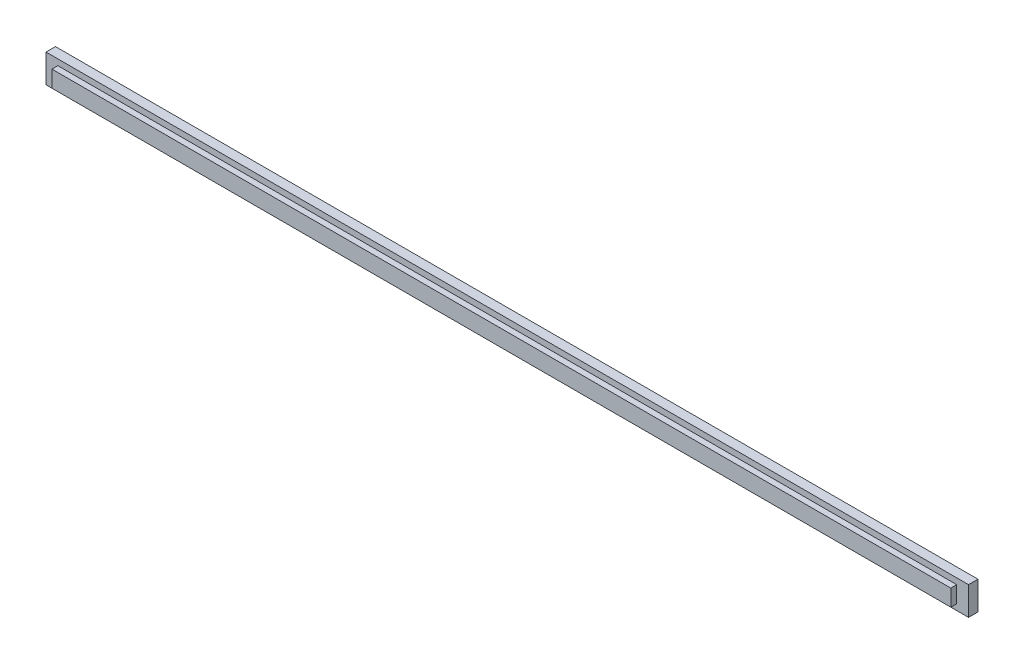
ISO-10303-21;
HEADER;
FILE_DESCRIPTION(('STEP AP214'),'2;1');
FILE_NAME('part.step','',(''),(''),'','','');
FILE_SCHEMA(('AUTOMOTIVE_DESIGN { 1 0 10303 214 1 1 1 1 }'));
ENDSEC;
DATA;
#1=APPLICATION_CONTEXT('core data for automotive mechanical design processes');
#2=APPLICATION_PROTOCOL_DEFINITION('international standard','automotive_design',2000,#1);
#3=PRODUCT_CONTEXT('',#1,'mechanical');
#4=PRODUCT('Part','Part','',(#3));
#5=PRODUCT_RELATED_PRODUCT_CATEGORY('part','',(#4));
#6=PRODUCT_DEFINITION_FORMATION('','',#4);
#7=PRODUCT_DEFINITION_CONTEXT('part definition',#1,'design');
#8=PRODUCT_DEFINITION('design','',#6,#7);
#9=PRODUCT_DEFINITION_SHAPE('','',#8);
#10=(LENGTH_UNIT() NAMED_UNIT(*) SI_UNIT(.MILLI.,.METRE.));
#11=(NAMED_UNIT(*) PLANE_ANGLE_UNIT() SI_UNIT($,.RADIAN.));
#12=(NAMED_UNIT(*) SI_UNIT($,.STERADIAN.) SOLID_ANGLE_UNIT());
#13=UNCERTAINTY_MEASURE_WITH_UNIT(LENGTH_MEASURE(1.E-05),#10,'distance_accuracy_value','');
#14=(GEOMETRIC_REPRESENTATION_CONTEXT(3) GLOBAL_UNCERTAINTY_ASSIGNED_CONTEXT((#13)) GLOBAL_UNIT_ASSIGNED_CONTEXT((#10,
#11,#12)) REPRESENTATION_CONTEXT('',''));
#15=CARTESIAN_POINT('',(0.,0.,0.));
#16=DIRECTION('',(0.,0.,1.));
#17=DIRECTION('',(1.,0.,0.));
#18=AXIS2_PLACEMENT_3D('',#15,#16,#17);
#19=CARTESIAN_POINT('',(0.,0.,4.));
#20=DIRECTION('',(0.,0.,-1.));
#21=DIRECTION('',(-1.,0.,0.));
#22=AXIS2_PLACEMENT_3D('',#19,#20,#21);
#23=PLANE('',#22);
#24=DIRECTION('',(0.,-1.,0.));
#25=VECTOR('',#24,1.);
#26=CARTESIAN_POINT('',(-195.,-6.,4.));
#27=LINE('',#26,#25);
#28=CARTESIAN_POINT('',(-195.,6.,4.));
#29=VERTEX_POINT('',#28);
#30=CARTESIAN_POINT('',(-195.,-6.,4.));
#31=VERTEX_POINT('',#30);
#32=EDGE_CURVE('E133',#29,#31,#27,.T.);
#33=ORIENTED_EDGE('',*,*,#32,.T.);
#34=DIRECTION('',(1.,0.,0.));
#35=VECTOR('',#34,1.);
#36=CARTESIAN_POINT('',(-195.,-6.,4.));
#37=LINE('',#36,#35);
#38=CARTESIAN_POINT('',(195.,-6.,4.));
#39=VERTEX_POINT('',#38);
#40=EDGE_CURVE('E136',#31,#39,#37,.T.);
#41=ORIENTED_EDGE('',*,*,#40,.T.);
#42=DIRECTION('',(0.,1.,0.));
#43=VECTOR('',#42,1.);
#44=CARTESIAN_POINT('',(195.,-6.,4.));
#45=LINE('',#44,#43);
#46=CARTESIAN_POINT('',(195.,6.,4.));
#47=VERTEX_POINT('',#46);
#48=EDGE_CURVE('E139',#39,#47,#45,.T.);
#49=ORIENTED_EDGE('',*,*,#48,.T.);
#50=DIRECTION('',(-1.,0.,0.));
#51=VECTOR('',#50,1.);
#52=CARTESIAN_POINT('',(-195.,6.,4.));
#53=LINE('',#52,#51);
#54=EDGE_CURVE('E141',#47,#29,#53,.T.);
#55=ORIENTED_EDGE('',*,*,#54,.T.);
#56=EDGE_LOOP('',(#33,#41,#49,#55));
#57=FACE_BOUND('',#56,.T.);
#58=DIRECTION('',(0.,-1.,0.));
#59=VECTOR('',#58,1.);
#60=CARTESIAN_POINT('',(-190.,-3.5,4.));
#61=LINE('',#60,#59);
#62=CARTESIAN_POINT('',(-190.,3.5,4.));
#63=VERTEX_POINT('',#62);
#64=CARTESIAN_POINT('',(-190.,-3.5,4.));
#65=VERTEX_POINT('',#64);
#66=EDGE_CURVE('E54',#63,#65,#61,.T.);
#67=ORIENTED_EDGE('',*,*,#66,.F.);
#68=DIRECTION('',(-1.,0.,0.));
#69=VECTOR('',#68,1.);
#70=CARTESIAN_POINT('',(-190.,3.5,4.));
#71=LINE('',#70,#69);
#72=CARTESIAN_POINT('',(190.,3.5,4.));
#73=VERTEX_POINT('',#72);
#74=EDGE_CURVE('E58',#73,#63,#71,.T.);
#75=ORIENTED_EDGE('',*,*,#74,.F.);
#76=DIRECTION('',(0.,1.,0.));
#77=VECTOR('',#76,1.);
#78=CARTESIAN_POINT('',(190.,-3.5,4.));
#79=LINE('',#78,#77);
#80=CARTESIAN_POINT('',(190.,-3.5,4.));
#81=VERTEX_POINT('',#80);
#82=EDGE_CURVE('E251',#81,#73,#79,.T.);
#83=ORIENTED_EDGE('',*,*,#82,.F.);
#84=DIRECTION('',(1.,0.,0.));
#85=VECTOR('',#84,1.);
#86=CARTESIAN_POINT('',(-190.,-3.5,4.));
#87=LINE('',#86,#85);
#88=EDGE_CURVE('E257',#65,#81,#87,.T.);
#89=ORIENTED_EDGE('',*,*,#88,.F.);
#90=EDGE_LOOP('',(#67,#75,#83,#89));
#91=FACE_BOUND('',#90,.T.);
#92=ADVANCED_FACE('F39',(#57,#91),#23,.F.);
#93=CARTESIAN_POINT('',(-195.,-6.,4.));
#94=DIRECTION('',(1.,0.,0.));
#95=DIRECTION('',(0.,0.,-1.));
#96=AXIS2_PLACEMENT_3D('',#93,#94,#95);
#97=PLANE('',#96);
#98=DIRECTION('',(0.,-1.,0.));
#99=VECTOR('',#98,1.);
#100=CARTESIAN_POINT('',(-195.,-6.,0.));
#101=LINE('',#100,#99);
#102=CARTESIAN_POINT('',(-195.,6.,0.));
#103=VERTEX_POINT('',#102);
#104=CARTESIAN_POINT('',(-195.,-6.,0.));
#105=VERTEX_POINT('',#104);
#106=EDGE_CURVE('E124',#103,#105,#101,.T.);
#107=ORIENTED_EDGE('',*,*,#106,.T.);
#108=DIRECTION('',(0.,0.,-1.));
#109=VECTOR('',#108,1.);
#110=CARTESIAN_POINT('',(-195.,-6.,4.));
#111=LINE('',#110,#109);
#112=EDGE_CURVE('E11',#31,#105,#111,.T.);
#113=ORIENTED_EDGE('',*,*,#112,.F.);
#114=ORIENTED_EDGE('',*,*,#32,.F.);
#115=DIRECTION('',(0.,0.,-1.));
#116=VECTOR('',#115,1.);
#117=CARTESIAN_POINT('',(-195.,6.,4.));
#118=LINE('',#117,#116);
#119=EDGE_CURVE('E142',#29,#103,#118,.T.);
#120=ORIENTED_EDGE('',*,*,#119,.T.);
#121=EDGE_LOOP('',(#107,#113,#114,#120));
#122=FACE_BOUND('',#121,.T.);
#123=ADVANCED_FACE('F41',(#122),#97,.F.);
#124=CARTESIAN_POINT('',(-195.,-6.,4.));
#125=DIRECTION('',(0.,1.,0.));
#126=DIRECTION('',(0.,0.,1.));
#127=AXIS2_PLACEMENT_3D('',#124,#125,#126);
#128=PLANE('',#127);
#129=DIRECTION('',(1.,0.,0.));
#130=VECTOR('',#129,1.);
#131=CARTESIAN_POINT('',(-195.,-6.,0.));
#132=LINE('',#131,#130);
#133=CARTESIAN_POINT('',(195.,-6.,0.));
#134=VERTEX_POINT('',#133);
#135=EDGE_CURVE('E127',#105,#134,#132,.T.);
#136=ORIENTED_EDGE('',*,*,#135,.T.);
#137=DIRECTION('',(0.,0.,-1.));
#138=VECTOR('',#137,1.);
#139=CARTESIAN_POINT('',(195.,-6.,4.));
#140=LINE('',#139,#138);
#141=EDGE_CURVE('E47',#39,#134,#140,.T.);
#142=ORIENTED_EDGE('',*,*,#141,.F.);
#143=ORIENTED_EDGE('',*,*,#40,.F.);
#144=ORIENTED_EDGE('',*,*,#112,.T.);
#145=EDGE_LOOP('',(#136,#142,#143,#144));
#146=FACE_BOUND('',#145,.T.);
#147=ADVANCED_FACE('F172',(#146),#128,.F.);
#148=CARTESIAN_POINT('',(195.,-6.,4.));
#149=DIRECTION('',(-1.,0.,0.));
#150=DIRECTION('',(0.,0.,1.));
#151=AXIS2_PLACEMENT_3D('',#148,#149,#150);
#152=PLANE('',#151);
#153=DIRECTION('',(0.,1.,0.));
#154=VECTOR('',#153,1.);
#155=CARTESIAN_POINT('',(195.,-6.,0.));
#156=LINE('',#155,#154);
#157=CARTESIAN_POINT('',(195.,6.,0.));
#158=VERTEX_POINT('',#157);
#159=EDGE_CURVE('E145',#134,#158,#156,.T.);
#160=ORIENTED_EDGE('',*,*,#159,.T.);
#161=DIRECTION('',(0.,0.,-1.));
#162=VECTOR('',#161,1.);
#163=CARTESIAN_POINT('',(195.,6.,4.));
#164=LINE('',#163,#162);
#165=EDGE_CURVE('E150',#47,#158,#164,.T.);
#166=ORIENTED_EDGE('',*,*,#165,.F.);
#167=ORIENTED_EDGE('',*,*,#48,.F.);
#168=ORIENTED_EDGE('',*,*,#141,.T.);
#169=EDGE_LOOP('',(#160,#166,#167,#168));
#170=FACE_BOUND('',#169,.T.);
#171=ADVANCED_FACE('F157',(#170),#152,.F.);
#172=CARTESIAN_POINT('',(-195.,6.,4.));
#173=DIRECTION('',(0.,-1.,0.));
#174=DIRECTION('',(0.,0.,-1.));
#175=AXIS2_PLACEMENT_3D('',#172,#173,#174);
#176=PLANE('',#175);
#177=DIRECTION('',(-1.,0.,0.));
#178=VECTOR('',#177,1.);
#179=CARTESIAN_POINT('',(-195.,6.,0.));
#180=LINE('',#179,#178);
#181=EDGE_CURVE('E137',#158,#103,#180,.T.);
#182=ORIENTED_EDGE('',*,*,#181,.T.);
#183=ORIENTED_EDGE('',*,*,#119,.F.);
#184=ORIENTED_EDGE('',*,*,#54,.F.);
#185=ORIENTED_EDGE('',*,*,#165,.T.);
#186=EDGE_LOOP('',(#182,#183,#184,#185));
#187=FACE_BOUND('',#186,.T.);
#188=ADVANCED_FACE('F166',(#187),#176,.F.);
#189=CARTESIAN_POINT('',(0.,0.,0.));
#190=DIRECTION('',(0.,0.,-1.));
#191=DIRECTION('',(-1.,0.,0.));
#192=AXIS2_PLACEMENT_3D('',#189,#190,#191);
#193=PLANE('',#192);
#194=ORIENTED_EDGE('',*,*,#106,.F.);
#195=ORIENTED_EDGE('',*,*,#181,.F.);
#196=ORIENTED_EDGE('',*,*,#159,.F.);
#197=ORIENTED_EDGE('',*,*,#135,.F.);
#198=EDGE_LOOP('',(#194,#195,#196,#197));
#199=FACE_BOUND('',#198,.T.);
#200=ADVANCED_FACE('F163',(#199),#193,.T.);
#201=CARTESIAN_POINT('',(-190.,-3.5,6.5));
#202=DIRECTION('',(1.,0.,0.));
#203=DIRECTION('',(0.,0.,-1.));
#204=AXIS2_PLACEMENT_3D('',#201,#202,#203);
#205=PLANE('',#204);
#206=ORIENTED_EDGE('',*,*,#66,.T.);
#207=DIRECTION('',(0.,0.,-1.));
#208=VECTOR('',#207,1.);
#209=CARTESIAN_POINT('',(-190.,-3.5,6.5));
#210=LINE('',#209,#208);
#211=CARTESIAN_POINT('',(-190.,-3.5,6.5));
#212=VERTEX_POINT('',#211);
#213=EDGE_CURVE('E107',#212,#65,#210,.T.);
#214=ORIENTED_EDGE('',*,*,#213,.F.);
#215=DIRECTION('',(0.,-1.,0.));
#216=VECTOR('',#215,1.);
#217=CARTESIAN_POINT('',(-190.,-3.5,6.5));
#218=LINE('',#217,#216);
#219=CARTESIAN_POINT('',(-190.,3.5,6.5));
#220=VERTEX_POINT('',#219);
#221=EDGE_CURVE('E113',#220,#212,#218,.T.);
#222=ORIENTED_EDGE('',*,*,#221,.F.);
#223=DIRECTION('',(0.,0.,-1.));
#224=VECTOR('',#223,1.);
#225=CARTESIAN_POINT('',(-190.,3.5,6.5));
#226=LINE('',#225,#224);
#227=EDGE_CURVE('E249',#220,#63,#226,.T.);
#228=ORIENTED_EDGE('',*,*,#227,.T.);
#229=EDGE_LOOP('',(#206,#214,#222,#228));
#230=FACE_BOUND('',#229,.T.);
#231=ADVANCED_FACE('F123',(#230),#205,.F.);
#232=CARTESIAN_POINT('',(-190.,-3.5,6.5));
#233=DIRECTION('',(0.,1.,0.));
#234=DIRECTION('',(0.,0.,1.));
#235=AXIS2_PLACEMENT_3D('',#232,#233,#234);
#236=PLANE('',#235);
#237=ORIENTED_EDGE('',*,*,#88,.T.);
#238=DIRECTION('',(0.,0.,-1.));
#239=VECTOR('',#238,1.);
#240=CARTESIAN_POINT('',(190.,-3.5,6.5));
#241=LINE('',#240,#239);
#242=CARTESIAN_POINT('',(190.,-3.5,6.5));
#243=VERTEX_POINT('',#242);
#244=EDGE_CURVE('E109',#243,#81,#241,.T.);
#245=ORIENTED_EDGE('',*,*,#244,.F.);
#246=DIRECTION('',(1.,0.,0.));
#247=VECTOR('',#246,1.);
#248=CARTESIAN_POINT('',(-190.,-3.5,6.5));
#249=LINE('',#248,#247);
#250=EDGE_CURVE('E102',#212,#243,#249,.T.);
#251=ORIENTED_EDGE('',*,*,#250,.F.);
#252=ORIENTED_EDGE('',*,*,#213,.T.);
#253=EDGE_LOOP('',(#237,#245,#251,#252));
#254=FACE_BOUND('',#253,.T.);
#255=ADVANCED_FACE('F105',(#254),#236,.F.);
#256=CARTESIAN_POINT('',(190.,-3.5,6.5));
#257=DIRECTION('',(-1.,0.,0.));
#258=DIRECTION('',(0.,0.,1.));
#259=AXIS2_PLACEMENT_3D('',#256,#257,#258);
#260=PLANE('',#259);
#261=ORIENTED_EDGE('',*,*,#82,.T.);
#262=DIRECTION('',(0.,0.,-1.));
#263=VECTOR('',#262,1.);
#264=CARTESIAN_POINT('',(190.,3.5,6.5));
#265=LINE('',#264,#263);
#266=CARTESIAN_POINT('',(190.,3.5,6.5));
#267=VERTEX_POINT('',#266);
#268=EDGE_CURVE('E129',#267,#73,#265,.T.);
#269=ORIENTED_EDGE('',*,*,#268,.F.);
#270=DIRECTION('',(0.,1.,0.));
#271=VECTOR('',#270,1.);
#272=CARTESIAN_POINT('',(190.,-3.5,6.5));
#273=LINE('',#272,#271);
#274=EDGE_CURVE('E112',#243,#267,#273,.T.);
#275=ORIENTED_EDGE('',*,*,#274,.F.);
#276=ORIENTED_EDGE('',*,*,#244,.T.);
#277=EDGE_LOOP('',(#261,#269,#275,#276));
#278=FACE_BOUND('',#277,.T.);
#279=ADVANCED_FACE('F219',(#278),#260,.F.);
#280=CARTESIAN_POINT('',(-190.,3.5,6.5));
#281=DIRECTION('',(0.,-1.,0.));
#282=DIRECTION('',(0.,0.,-1.));
#283=AXIS2_PLACEMENT_3D('',#280,#281,#282);
#284=PLANE('',#283);
#285=ORIENTED_EDGE('',*,*,#74,.T.);
#286=ORIENTED_EDGE('',*,*,#227,.F.);
#287=DIRECTION('',(-1.,0.,0.));
#288=VECTOR('',#287,1.);
#289=CARTESIAN_POINT('',(-190.,3.5,6.5));
#290=LINE('',#289,#288);
#291=EDGE_CURVE('E118',#267,#220,#290,.T.);
#292=ORIENTED_EDGE('',*,*,#291,.F.);
#293=ORIENTED_EDGE('',*,*,#268,.T.);
#294=EDGE_LOOP('',(#285,#286,#292,#293));
#295=FACE_BOUND('',#294,.T.);
#296=ADVANCED_FACE('F227',(#295),#284,.F.);
#297=CARTESIAN_POINT('',(0.,0.,6.5));
#298=DIRECTION('',(0.,0.,-1.));
#299=DIRECTION('',(-1.,0.,0.));
#300=AXIS2_PLACEMENT_3D('',#297,#298,#299);
#301=PLANE('',#300);
#302=ORIENTED_EDGE('',*,*,#221,.T.);
#303=ORIENTED_EDGE('',*,*,#250,.T.);
#304=ORIENTED_EDGE('',*,*,#274,.T.);
#305=ORIENTED_EDGE('',*,*,#291,.T.);
#306=EDGE_LOOP('',(#302,#303,#304,#305));
#307=FACE_BOUND('',#306,.T.);
#308=ADVANCED_FACE('F116',(#307),#301,.F.);
#309=CLOSED_SHELL('',(#92,#123,#147,#171,#188,#200,#231,#255,#279,#296,#308));
#310=MANIFOLD_SOLID_BREP('B2',#309);
#311=ADVANCED_BREP_SHAPE_REPRESENTATION('',(#18,#310),#14);
#312=SHAPE_DEFINITION_REPRESENTATION(#9,#311);
ENDSEC;
END-ISO-10303-21;
